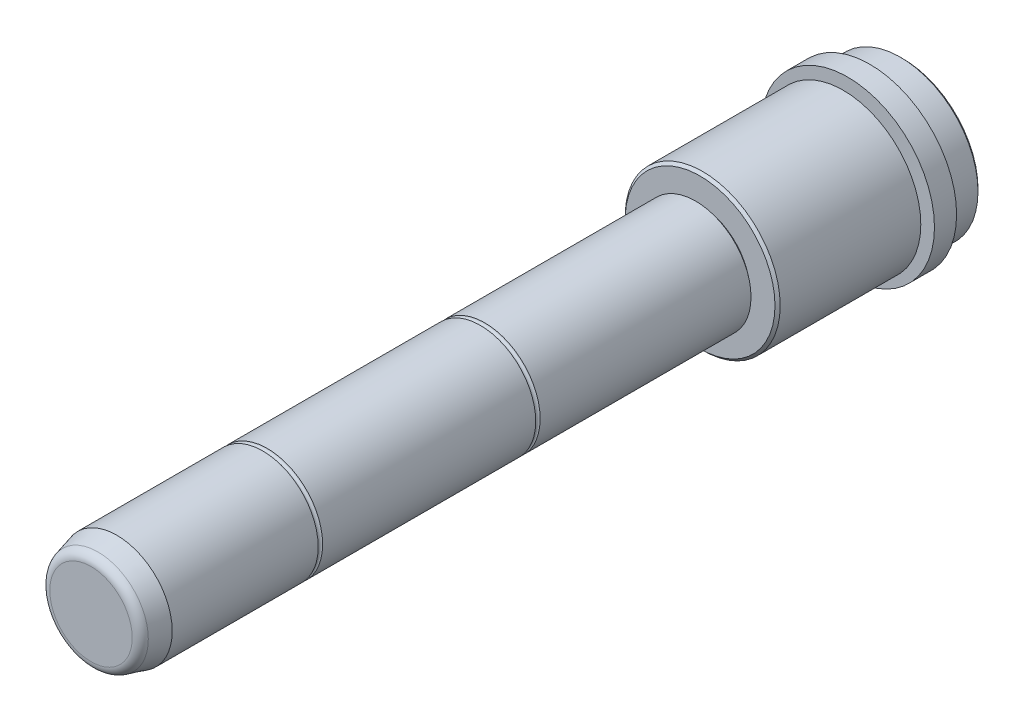
ISO-10303-21;
HEADER;
FILE_DESCRIPTION(('STEP AP214'),'2;1');
FILE_NAME('part.step','',(''),(''),'','','');
FILE_SCHEMA(('AUTOMOTIVE_DESIGN { 1 0 10303 214 1 1 1 1 }'));
ENDSEC;
DATA;
#1=APPLICATION_CONTEXT('core data for automotive mechanical design processes');
#2=APPLICATION_PROTOCOL_DEFINITION('international standard','automotive_design',2000,#1);
#3=PRODUCT_CONTEXT('',#1,'mechanical');
#4=PRODUCT('Part','Part','',(#3));
#5=PRODUCT_RELATED_PRODUCT_CATEGORY('part','',(#4));
#6=PRODUCT_DEFINITION_FORMATION('','',#4);
#7=PRODUCT_DEFINITION_CONTEXT('part definition',#1,'design');
#8=PRODUCT_DEFINITION('design','',#6,#7);
#9=PRODUCT_DEFINITION_SHAPE('','',#8);
#10=(LENGTH_UNIT() NAMED_UNIT(*) SI_UNIT(.MILLI.,.METRE.));
#11=(NAMED_UNIT(*) PLANE_ANGLE_UNIT() SI_UNIT($,.RADIAN.));
#12=(NAMED_UNIT(*) SI_UNIT($,.STERADIAN.) SOLID_ANGLE_UNIT());
#13=UNCERTAINTY_MEASURE_WITH_UNIT(LENGTH_MEASURE(1.E-05),#10,'distance_accuracy_value','');
#14=(GEOMETRIC_REPRESENTATION_CONTEXT(3) GLOBAL_UNCERTAINTY_ASSIGNED_CONTEXT((#13)) GLOBAL_UNIT_ASSIGNED_CONTEXT((#10,
#11,#12)) REPRESENTATION_CONTEXT('',''));
#15=CARTESIAN_POINT('',(0.,0.,0.));
#16=DIRECTION('',(0.,0.,1.));
#17=DIRECTION('',(1.,0.,0.));
#18=AXIS2_PLACEMENT_3D('',#15,#16,#17);
#19=CARTESIAN_POINT('',(0.,0.,55.));
#20=DIRECTION('',(0.,0.,1.));
#21=DIRECTION('',(1.,0.,0.));
#22=AXIS2_PLACEMENT_3D('',#19,#20,#21);
#23=CYLINDRICAL_SURFACE('',#22,15.);
#24=CARTESIAN_POINT('',(0.,0.,56.2));
#25=DIRECTION('',(0.,0.,1.));
#26=DIRECTION('',(1.,0.,0.));
#27=AXIS2_PLACEMENT_3D('',#24,#25,#26);
#28=CIRCLE('',#27,15.);
#29=CARTESIAN_POINT('',(15.,0.,56.2));
#30=VERTEX_POINT('',#29);
#31=EDGE_CURVE('E83',#30,#30,#28,.T.);
#32=ORIENTED_EDGE('',*,*,#31,.T.);
#33=EDGE_LOOP('',(#32));
#34=FACE_BOUND('',#33,.T.);
#35=CARTESIAN_POINT('',(0.,0.,113.328570957143));
#36=DIRECTION('',(0.,0.,1.));
#37=DIRECTION('',(1.,0.,0.));
#38=AXIS2_PLACEMENT_3D('',#35,#36,#37);
#39=CIRCLE('',#38,15.);
#40=CARTESIAN_POINT('',(15.,0.,113.328570957143));
#41=VERTEX_POINT('',#40);
#42=EDGE_CURVE('E101',#41,#41,#39,.T.);
#43=ORIENTED_EDGE('',*,*,#42,.F.);
#44=EDGE_LOOP('',(#43));
#45=FACE_BOUND('',#44,.T.);
#46=ADVANCED_FACE('F33',(#34,#45),#23,.T.);
#47=CARTESIAN_POINT('',(0.,0.,55.));
#48=DIRECTION('',(0.,0.,-1.));
#49=DIRECTION('',(-1.,0.,0.));
#50=AXIS2_PLACEMENT_3D('',#47,#48,#49);
#51=PLANE('',#50);
#52=CARTESIAN_POINT('',(0.,0.,55.));
#53=DIRECTION('',(0.,0.,1.));
#54=DIRECTION('',(1.,0.,0.));
#55=AXIS2_PLACEMENT_3D('',#52,#53,#54);
#56=CIRCLE('',#55,20.2928932188134);
#57=CARTESIAN_POINT('',(20.2928932188134,0.,55.));
#58=VERTEX_POINT('',#57);
#59=EDGE_CURVE('E74',#58,#58,#56,.T.);
#60=ORIENTED_EDGE('',*,*,#59,.T.);
#61=EDGE_LOOP('',(#60));
#62=FACE_BOUND('',#61,.T.);
#63=CARTESIAN_POINT('',(0.,0.,55.));
#64=DIRECTION('',(0.,0.,1.));
#65=DIRECTION('',(1.,0.,0.));
#66=AXIS2_PLACEMENT_3D('',#63,#64,#65);
#67=CIRCLE('',#66,13.5);
#68=CARTESIAN_POINT('',(13.5,0.,55.));
#69=VERTEX_POINT('',#68);
#70=EDGE_CURVE('E80',#69,#69,#67,.T.);
#71=ORIENTED_EDGE('',*,*,#70,.F.);
#72=EDGE_LOOP('',(#71));
#73=FACE_BOUND('',#72,.T.);
#74=ADVANCED_FACE('F128',(#62,#73),#51,.F.);
#75=CARTESIAN_POINT('',(0.,0.,15.));
#76=DIRECTION('',(0.,0.,1.));
#77=DIRECTION('',(1.,0.,0.));
#78=AXIS2_PLACEMENT_3D('',#75,#76,#77);
#79=CYLINDRICAL_SURFACE('',#78,21.);
#80=CARTESIAN_POINT('',(0.,0.,16.2));
#81=DIRECTION('',(0.,0.,1.));
#82=DIRECTION('',(1.,0.,0.));
#83=AXIS2_PLACEMENT_3D('',#80,#81,#82);
#84=CIRCLE('',#83,21.);
#85=CARTESIAN_POINT('',(21.,0.,16.2));
#86=VERTEX_POINT('',#85);
#87=EDGE_CURVE('E68',#86,#86,#84,.T.);
#88=ORIENTED_EDGE('',*,*,#87,.T.);
#89=EDGE_LOOP('',(#88));
#90=FACE_BOUND('',#89,.T.);
#91=CARTESIAN_POINT('',(0.,0.,54.2928932188135));
#92=DIRECTION('',(0.,0.,1.));
#93=DIRECTION('',(1.,0.,0.));
#94=AXIS2_PLACEMENT_3D('',#91,#92,#93);
#95=CIRCLE('',#94,21.);
#96=CARTESIAN_POINT('',(21.,0.,54.2928932188135));
#97=VERTEX_POINT('',#96);
#98=EDGE_CURVE('E71',#97,#97,#95,.T.);
#99=ORIENTED_EDGE('',*,*,#98,.F.);
#100=EDGE_LOOP('',(#99));
#101=FACE_BOUND('',#100,.T.);
#102=ADVANCED_FACE('F135',(#90,#101),#79,.T.);
#103=CARTESIAN_POINT('',(0.,0.,15.));
#104=DIRECTION('',(0.,0.,-1.));
#105=DIRECTION('',(-1.,0.,0.));
#106=AXIS2_PLACEMENT_3D('',#103,#104,#105);
#107=PLANE('',#106);
#108=CARTESIAN_POINT('',(0.,0.,15.));
#109=DIRECTION('',(0.,0.,1.));
#110=DIRECTION('',(1.,0.,0.));
#111=AXIS2_PLACEMENT_3D('',#108,#109,#110);
#112=CIRCLE('',#111,23.5);
#113=CARTESIAN_POINT('',(23.5,0.,15.));
#114=VERTEX_POINT('',#113);
#115=EDGE_CURVE('E56',#114,#114,#112,.T.);
#116=ORIENTED_EDGE('',*,*,#115,.T.);
#117=EDGE_LOOP('',(#116));
#118=FACE_BOUND('',#117,.T.);
#119=CARTESIAN_POINT('',(0.,0.,15.));
#120=DIRECTION('',(0.,0.,1.));
#121=DIRECTION('',(1.,0.,0.));
#122=AXIS2_PLACEMENT_3D('',#119,#120,#121);
#123=CIRCLE('',#122,18.9);
#124=CARTESIAN_POINT('',(18.9,0.,15.));
#125=VERTEX_POINT('',#124);
#126=EDGE_CURVE('E65',#125,#125,#123,.T.);
#127=ORIENTED_EDGE('',*,*,#126,.F.);
#128=EDGE_LOOP('',(#127));
#129=FACE_BOUND('',#128,.T.);
#130=ADVANCED_FACE('F188',(#118,#129),#107,.F.);
#131=CARTESIAN_POINT('',(0.,0.,0.));
#132=DIRECTION('',(0.,0.,1.));
#133=DIRECTION('',(1.,0.,0.));
#134=AXIS2_PLACEMENT_3D('',#131,#132,#133);
#135=CYLINDRICAL_SURFACE('',#134,21.);
#136=CARTESIAN_POINT('',(0.,0.,0.707106781186547));
#137=DIRECTION('',(0.,0.,1.));
#138=DIRECTION('',(1.,0.,0.));
#139=AXIS2_PLACEMENT_3D('',#136,#137,#138);
#140=CIRCLE('',#139,21.);
#141=CARTESIAN_POINT('',(21.,0.,0.707106781186547));
#142=VERTEX_POINT('',#141);
#143=EDGE_CURVE('E40',#142,#142,#140,.T.);
#144=ORIENTED_EDGE('',*,*,#143,.T.);
#145=EDGE_LOOP('',(#144));
#146=FACE_BOUND('',#145,.T.);
#147=CARTESIAN_POINT('',(0.,0.,7.8));
#148=DIRECTION('',(0.,0.,1.));
#149=DIRECTION('',(1.,0.,0.));
#150=AXIS2_PLACEMENT_3D('',#147,#148,#149);
#151=CIRCLE('',#150,21.);
#152=CARTESIAN_POINT('',(21.,0.,7.8));
#153=VERTEX_POINT('',#152);
#154=EDGE_CURVE('E53',#153,#153,#151,.T.);
#155=ORIENTED_EDGE('',*,*,#154,.F.);
#156=EDGE_LOOP('',(#155));
#157=FACE_BOUND('',#156,.T.);
#158=ADVANCED_FACE('F35',(#146,#157),#135,.T.);
#159=CARTESIAN_POINT('',(0.,0.,0.707106781186547));
#160=DIRECTION('',(0.,0.,1.));
#161=DIRECTION('',(1.,0.,0.));
#162=AXIS2_PLACEMENT_3D('',#159,#160,#161);
#163=CONICAL_SURFACE('',#162,21.,0.785398163397449);
#164=CARTESIAN_POINT('',(0.,0.,0.));
#165=DIRECTION('',(0.,0.,1.));
#166=DIRECTION('',(1.,0.,0.));
#167=AXIS2_PLACEMENT_3D('',#164,#165,#166);
#168=CIRCLE('',#167,20.2928932188135);
#169=CARTESIAN_POINT('',(20.2928932188135,0.,0.));
#170=VERTEX_POINT('',#169);
#171=EDGE_CURVE('E10',#170,#170,#168,.T.);
#172=ORIENTED_EDGE('',*,*,#171,.T.);
#173=EDGE_LOOP('',(#172));
#174=FACE_BOUND('',#173,.T.);
#175=ORIENTED_EDGE('',*,*,#143,.F.);
#176=EDGE_LOOP('',(#175));
#177=FACE_BOUND('',#176,.T.);
#178=ADVANCED_FACE('F210',(#174,#177),#163,.T.);
#179=CARTESIAN_POINT('',(0.,21.,0.));
#180=DIRECTION('',(0.,0.,1.));
#181=DIRECTION('',(1.,0.,0.));
#182=AXIS2_PLACEMENT_3D('',#179,#180,#181);
#183=PLANE('',#182);
#184=ORIENTED_EDGE('',*,*,#171,.F.);
#185=EDGE_LOOP('',(#184));
#186=FACE_BOUND('',#185,.T.);
#187=ADVANCED_FACE('F208',(#186),#183,.F.);
#188=CARTESIAN_POINT('',(0.,0.,0.));
#189=DIRECTION('',(0.,0.,1.));
#190=DIRECTION('',(1.,0.,0.));
#191=AXIS2_PLACEMENT_3D('',#188,#189,#190);
#192=CYLINDRICAL_SURFACE('',#191,18.9);
#193=CARTESIAN_POINT('',(0.,0.,7.8));
#194=DIRECTION('',(0.,0.,1.));
#195=DIRECTION('',(1.,0.,0.));
#196=AXIS2_PLACEMENT_3D('',#193,#194,#195);
#197=CIRCLE('',#196,18.9);
#198=CARTESIAN_POINT('',(18.9,0.,7.8));
#199=VERTEX_POINT('',#198);
#200=EDGE_CURVE('E48',#199,#199,#197,.T.);
#201=ORIENTED_EDGE('',*,*,#200,.T.);
#202=EDGE_LOOP('',(#201));
#203=FACE_BOUND('',#202,.T.);
#204=CARTESIAN_POINT('',(0.,0.,9.));
#205=DIRECTION('',(0.,0.,1.));
#206=DIRECTION('',(1.,0.,0.));
#207=AXIS2_PLACEMENT_3D('',#204,#205,#206);
#208=CIRCLE('',#207,18.9);
#209=CARTESIAN_POINT('',(18.9,0.,9.));
#210=VERTEX_POINT('',#209);
#211=EDGE_CURVE('E44',#210,#210,#208,.T.);
#212=ORIENTED_EDGE('',*,*,#211,.F.);
#213=EDGE_LOOP('',(#212));
#214=FACE_BOUND('',#213,.T.);
#215=ADVANCED_FACE('F204',(#203,#214),#192,.T.);
#216=CARTESIAN_POINT('',(0.,18.9,7.8));
#217=DIRECTION('',(0.,0.,1.));
#218=DIRECTION('',(1.,0.,0.));
#219=AXIS2_PLACEMENT_3D('',#216,#217,#218);
#220=PLANE('',#219);
#221=ORIENTED_EDGE('',*,*,#154,.T.);
#222=EDGE_LOOP('',(#221));
#223=FACE_BOUND('',#222,.T.);
#224=ORIENTED_EDGE('',*,*,#200,.F.);
#225=EDGE_LOOP('',(#224));
#226=FACE_BOUND('',#225,.T.);
#227=ADVANCED_FACE('F197',(#223,#226),#220,.T.);
#228=CARTESIAN_POINT('',(0.,0.,9.));
#229=DIRECTION('',(0.,0.,1.));
#230=DIRECTION('',(1.,0.,0.));
#231=AXIS2_PLACEMENT_3D('',#228,#229,#230);
#232=CYLINDRICAL_SURFACE('',#231,23.5);
#233=ORIENTED_EDGE('',*,*,#115,.F.);
#234=EDGE_LOOP('',(#233));
#235=FACE_BOUND('',#234,.T.);
#236=CARTESIAN_POINT('',(0.,0.,9.));
#237=DIRECTION('',(0.,0.,1.));
#238=DIRECTION('',(1.,0.,0.));
#239=AXIS2_PLACEMENT_3D('',#236,#237,#238);
#240=CIRCLE('',#239,23.5);
#241=CARTESIAN_POINT('',(23.5,0.,9.));
#242=VERTEX_POINT('',#241);
#243=EDGE_CURVE('E59',#242,#242,#240,.T.);
#244=ORIENTED_EDGE('',*,*,#243,.T.);
#245=EDGE_LOOP('',(#244));
#246=FACE_BOUND('',#245,.T.);
#247=ADVANCED_FACE('F193',(#235,#246),#232,.T.);
#248=CARTESIAN_POINT('',(0.,23.5,9.));
#249=DIRECTION('',(0.,0.,1.));
#250=DIRECTION('',(1.,0.,0.));
#251=AXIS2_PLACEMENT_3D('',#248,#249,#250);
#252=PLANE('',#251);
#253=ORIENTED_EDGE('',*,*,#211,.T.);
#254=EDGE_LOOP('',(#253));
#255=FACE_BOUND('',#254,.T.);
#256=ORIENTED_EDGE('',*,*,#243,.F.);
#257=EDGE_LOOP('',(#256));
#258=FACE_BOUND('',#257,.T.);
#259=ADVANCED_FACE('F185',(#255,#258),#252,.F.);
#260=CARTESIAN_POINT('',(0.,21.,16.2));
#261=DIRECTION('',(0.,0.,-1.));
#262=DIRECTION('',(-1.,0.,0.));
#263=AXIS2_PLACEMENT_3D('',#260,#261,#262);
#264=PLANE('',#263);
#265=CARTESIAN_POINT('',(0.,0.,16.2));
#266=DIRECTION('',(0.,0.,1.));
#267=DIRECTION('',(1.,0.,0.));
#268=AXIS2_PLACEMENT_3D('',#265,#266,#267);
#269=CIRCLE('',#268,18.9);
#270=CARTESIAN_POINT('',(18.9,0.,16.2));
#271=VERTEX_POINT('',#270);
#272=EDGE_CURVE('E62',#271,#271,#269,.T.);
#273=ORIENTED_EDGE('',*,*,#272,.T.);
#274=EDGE_LOOP('',(#273));
#275=FACE_BOUND('',#274,.T.);
#276=ORIENTED_EDGE('',*,*,#87,.F.);
#277=EDGE_LOOP('',(#276));
#278=FACE_BOUND('',#277,.T.);
#279=ADVANCED_FACE('F178',(#275,#278),#264,.T.);
#280=CARTESIAN_POINT('',(0.,0.,15.));
#281=DIRECTION('',(0.,0.,1.));
#282=DIRECTION('',(1.,0.,0.));
#283=AXIS2_PLACEMENT_3D('',#280,#281,#282);
#284=CYLINDRICAL_SURFACE('',#283,18.9);
#285=ORIENTED_EDGE('',*,*,#126,.T.);
#286=EDGE_LOOP('',(#285));
#287=FACE_BOUND('',#286,.T.);
#288=ORIENTED_EDGE('',*,*,#272,.F.);
#289=EDGE_LOOP('',(#288));
#290=FACE_BOUND('',#289,.T.);
#291=ADVANCED_FACE('F168',(#287,#290),#284,.T.);
#292=CARTESIAN_POINT('',(0.,0.,55.));
#293=DIRECTION('',(0.,0.,-1.));
#294=DIRECTION('',(-1.,0.,0.));
#295=AXIS2_PLACEMENT_3D('',#292,#293,#294);
#296=CONICAL_SURFACE('',#295,20.2928932188134,0.785398163397461);
#297=ORIENTED_EDGE('',*,*,#98,.T.);
#298=EDGE_LOOP('',(#297));
#299=FACE_BOUND('',#298,.T.);
#300=ORIENTED_EDGE('',*,*,#59,.F.);
#301=EDGE_LOOP('',(#300));
#302=FACE_BOUND('',#301,.T.);
#303=ADVANCED_FACE('F163',(#299,#302),#296,.T.);
#304=CARTESIAN_POINT('',(0.,15.,56.2));
#305=DIRECTION('',(0.,0.,-1.));
#306=DIRECTION('',(-1.,0.,0.));
#307=AXIS2_PLACEMENT_3D('',#304,#305,#306);
#308=PLANE('',#307);
#309=CARTESIAN_POINT('',(0.,0.,56.2));
#310=DIRECTION('',(0.,0.,1.));
#311=DIRECTION('',(1.,0.,0.));
#312=AXIS2_PLACEMENT_3D('',#309,#310,#311);
#313=CIRCLE('',#312,13.5);
#314=CARTESIAN_POINT('',(13.5,0.,56.2));
#315=VERTEX_POINT('',#314);
#316=EDGE_CURVE('E77',#315,#315,#313,.T.);
#317=ORIENTED_EDGE('',*,*,#316,.T.);
#318=EDGE_LOOP('',(#317));
#319=FACE_BOUND('',#318,.T.);
#320=ORIENTED_EDGE('',*,*,#31,.F.);
#321=EDGE_LOOP('',(#320));
#322=FACE_BOUND('',#321,.T.);
#323=ADVANCED_FACE('F123',(#319,#322),#308,.T.);
#324=CARTESIAN_POINT('',(0.,0.,55.));
#325=DIRECTION('',(0.,0.,1.));
#326=DIRECTION('',(1.,0.,0.));
#327=AXIS2_PLACEMENT_3D('',#324,#325,#326);
#328=CYLINDRICAL_SURFACE('',#327,13.5);
#329=ORIENTED_EDGE('',*,*,#70,.T.);
#330=EDGE_LOOP('',(#329));
#331=FACE_BOUND('',#330,.T.);
#332=ORIENTED_EDGE('',*,*,#316,.F.);
#333=EDGE_LOOP('',(#332));
#334=FACE_BOUND('',#333,.T.);
#335=ADVANCED_FACE('F113',(#331,#334),#328,.T.);
#336=CARTESIAN_POINT('',(0.,0.,113.928570957143));
#337=DIRECTION('',(0.,0.,1.));
#338=DIRECTION('',(1.,0.,0.));
#339=AXIS2_PLACEMENT_3D('',#336,#337,#338);
#340=TOROIDAL_SURFACE('',#339,15.,0.599999999999996);
#341=ORIENTED_EDGE('',*,*,#42,.T.);
#342=EDGE_LOOP('',(#341));
#343=FACE_BOUND('',#342,.T.);
#344=CARTESIAN_POINT('',(0.,0.,114.528570957143));
#345=DIRECTION('',(0.,0.,1.));
#346=DIRECTION('',(1.,0.,0.));
#347=AXIS2_PLACEMENT_3D('',#344,#345,#346);
#348=CIRCLE('',#347,15.);
#349=CARTESIAN_POINT('',(15.,0.,114.528570957143));
#350=VERTEX_POINT('',#349);
#351=EDGE_CURVE('E104',#350,#350,#348,.T.);
#352=ORIENTED_EDGE('',*,*,#351,.F.);
#353=EDGE_LOOP('',(#352));
#354=FACE_BOUND('',#353,.T.);
#355=ADVANCED_FACE('F110',(#343,#354),#340,.F.);
#356=CARTESIAN_POINT('',(0.,0.,220.));
#357=DIRECTION('',(0.,0.,-1.));
#358=DIRECTION('',(-1.,0.,0.));
#359=AXIS2_PLACEMENT_3D('',#356,#357,#358);
#360=PLANE('',#359);
#361=CARTESIAN_POINT('',(0.,0.,220.));
#362=DIRECTION('',(0.,0.,1.));
#363=DIRECTION('',(1.,0.,0.));
#364=AXIS2_PLACEMENT_3D('',#361,#362,#363);
#365=CIRCLE('',#364,11.1676718336358);
#366=CARTESIAN_POINT('',(11.1676718336358,0.,220.));
#367=VERTEX_POINT('',#366);
#368=EDGE_CURVE('E89',#367,#367,#365,.T.);
#369=ORIENTED_EDGE('',*,*,#368,.T.);
#370=EDGE_LOOP('',(#369));
#371=FACE_BOUND('',#370,.T.);
#372=ADVANCED_FACE('F112',(#371),#360,.F.);
#373=CARTESIAN_POINT('',(0.,0.,217.45));
#374=DIRECTION('',(0.,0.,1.));
#375=DIRECTION('',(1.,0.,0.));
#376=AXIS2_PLACEMENT_3D('',#373,#374,#375);
#377=TOROIDAL_SURFACE('',#376,11.1676718336358,2.55000000000002);
#378=CARTESIAN_POINT('',(0.,0.,218.109988565011));
#379=DIRECTION('',(0.,0.,1.));
#380=DIRECTION('',(1.,0.,0.));
#381=AXIS2_PLACEMENT_3D('',#378,#379,#380);
#382=CIRCLE('',#381,13.6307826906729);
#383=CARTESIAN_POINT('',(13.6307826906729,0.,218.109988565011));
#384=VERTEX_POINT('',#383);
#385=EDGE_CURVE('E92',#384,#384,#382,.T.);
#386=ORIENTED_EDGE('',*,*,#385,.T.);
#387=EDGE_LOOP('',(#386));
#388=FACE_BOUND('',#387,.T.);
#389=ORIENTED_EDGE('',*,*,#368,.F.);
#390=EDGE_LOOP('',(#389));
#391=FACE_BOUND('',#390,.T.);
#392=ADVANCED_FACE('F120',(#388,#391),#377,.T.);
#393=CARTESIAN_POINT('',(0.,0.,220.));
#394=DIRECTION('',(0.,0.,-1.));
#395=DIRECTION('',(-1.,0.,0.));
#396=AXIS2_PLACEMENT_3D('',#393,#394,#395);
#397=CONICAL_SURFACE('',#396,13.1243556529821,0.261799387799149);
#398=ORIENTED_EDGE('',*,*,#385,.F.);
#399=EDGE_LOOP('',(#398));
#400=FACE_BOUND('',#399,.T.);
#401=CARTESIAN_POINT('',(0.,0.,213.));
#402=DIRECTION('',(0.,0.,1.));
#403=DIRECTION('',(1.,0.,0.));
#404=AXIS2_PLACEMENT_3D('',#401,#402,#403);
#405=CIRCLE('',#404,15.);
#406=CARTESIAN_POINT('',(15.,0.,213.));
#407=VERTEX_POINT('',#406);
#408=EDGE_CURVE('E86',#407,#407,#405,.T.);
#409=ORIENTED_EDGE('',*,*,#408,.T.);
#410=EDGE_LOOP('',(#409));
#411=FACE_BOUND('',#410,.T.);
#412=ADVANCED_FACE('F142',(#400,#411),#397,.T.);
#413=ORIENTED_EDGE('',*,*,#408,.F.);
#414=EDGE_LOOP('',(#413));
#415=FACE_BOUND('',#414,.T.);
#416=CARTESIAN_POINT('',(0.,0.,173.457142857143));
#417=DIRECTION('',(0.,0.,1.));
#418=DIRECTION('',(1.,0.,0.));
#419=AXIS2_PLACEMENT_3D('',#416,#417,#418);
#420=CIRCLE('',#419,15.);
#421=CARTESIAN_POINT('',(15.,0.,173.457142857143));
#422=VERTEX_POINT('',#421);
#423=EDGE_CURVE('E98',#422,#422,#420,.T.);
#424=ORIENTED_EDGE('',*,*,#423,.T.);
#425=EDGE_LOOP('',(#424));
#426=FACE_BOUND('',#425,.T.);
#427=ADVANCED_FACE('F131',(#415,#426),#23,.T.);
#428=CARTESIAN_POINT('',(0.,0.,172.857142857143));
#429=DIRECTION('',(0.,0.,1.));
#430=DIRECTION('',(1.,0.,0.));
#431=AXIS2_PLACEMENT_3D('',#428,#429,#430);
#432=TOROIDAL_SURFACE('',#431,15.,0.600000000000003);
#433=CARTESIAN_POINT('',(0.,0.,172.257142857143));
#434=DIRECTION('',(0.,0.,1.));
#435=DIRECTION('',(1.,0.,0.));
#436=AXIS2_PLACEMENT_3D('',#433,#434,#435);
#437=CIRCLE('',#436,15.);
#438=CARTESIAN_POINT('',(15.,0.,172.257142857143));
#439=VERTEX_POINT('',#438);
#440=EDGE_CURVE('E95',#439,#439,#437,.T.);
#441=ORIENTED_EDGE('',*,*,#440,.T.);
#442=EDGE_LOOP('',(#441));
#443=FACE_BOUND('',#442,.T.);
#444=ORIENTED_EDGE('',*,*,#423,.F.);
#445=EDGE_LOOP('',(#444));
#446=FACE_BOUND('',#445,.T.);
#447=ADVANCED_FACE('F141',(#443,#446),#432,.F.);
#448=ORIENTED_EDGE('',*,*,#440,.F.);
#449=EDGE_LOOP('',(#448));
#450=FACE_BOUND('',#449,.T.);
#451=ORIENTED_EDGE('',*,*,#351,.T.);
#452=EDGE_LOOP('',(#451));
#453=FACE_BOUND('',#452,.T.);
#454=ADVANCED_FACE('F108',(#450,#453),#23,.T.);
#455=CLOSED_SHELL('',(#46,#74,#102,#130,#158,#178,#187,#215,#227,#247,#259,#279,#291,#303,#323,
#335,#355,#372,#392,#412,#427,#447,#454));
#456=MANIFOLD_SOLID_BREP('B2',#455);
#457=ADVANCED_BREP_SHAPE_REPRESENTATION('',(#18,#456),#14);
#458=SHAPE_DEFINITION_REPRESENTATION(#9,#457);
ENDSEC;
END-ISO-10303-21;
